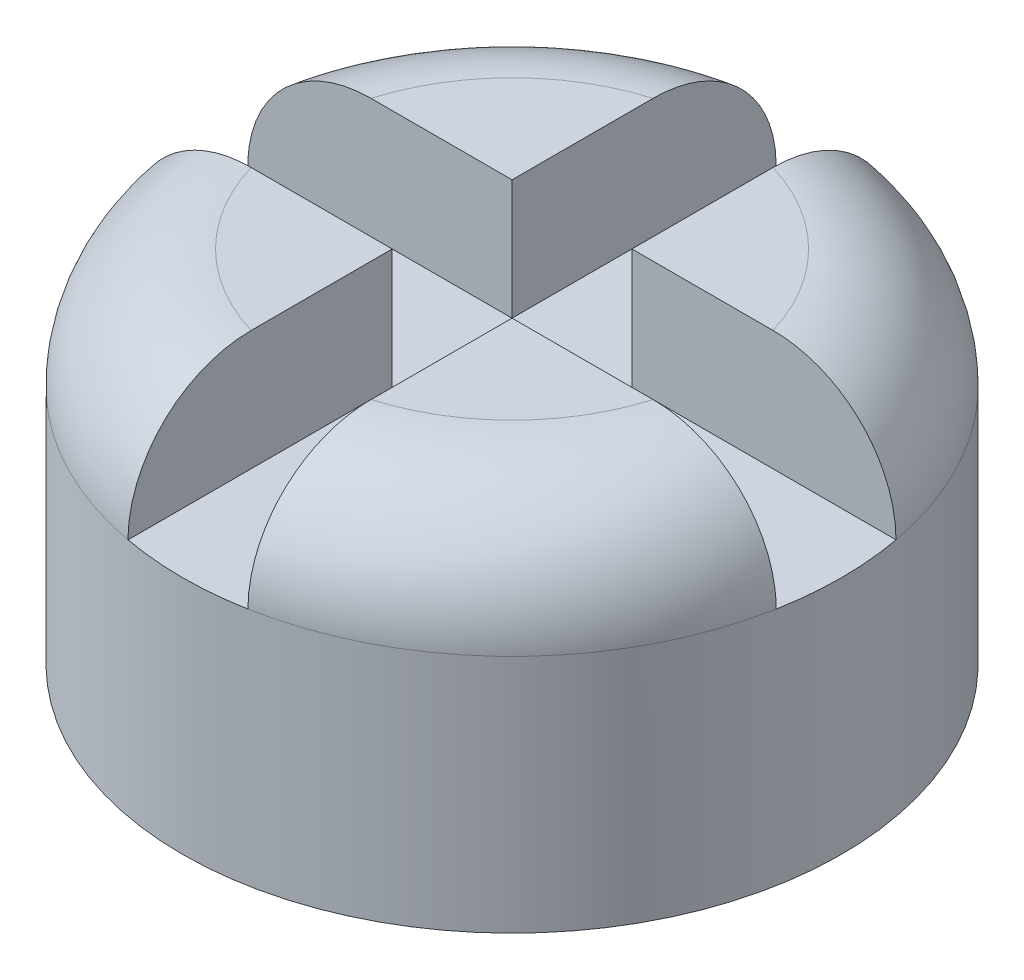
ISO-10303-21;
HEADER;
FILE_DESCRIPTION(('STEP AP214'),'2;1');
FILE_NAME('part.step','',(''),(''),'','','');
FILE_SCHEMA(('AUTOMOTIVE_DESIGN { 1 0 10303 214 1 1 1 1 }'));
ENDSEC;
DATA;
#1=APPLICATION_CONTEXT('core data for automotive mechanical design processes');
#2=APPLICATION_PROTOCOL_DEFINITION('international standard','automotive_design',2000,#1);
#3=PRODUCT_CONTEXT('',#1,'mechanical');
#4=PRODUCT('Part','Part','',(#3));
#5=PRODUCT_RELATED_PRODUCT_CATEGORY('part','',(#4));
#6=PRODUCT_DEFINITION_FORMATION('','',#4);
#7=PRODUCT_DEFINITION_CONTEXT('part definition',#1,'design');
#8=PRODUCT_DEFINITION('design','',#6,#7);
#9=PRODUCT_DEFINITION_SHAPE('','',#8);
#10=(LENGTH_UNIT() NAMED_UNIT(*) SI_UNIT(.MILLI.,.METRE.));
#11=(NAMED_UNIT(*) PLANE_ANGLE_UNIT() SI_UNIT($,.RADIAN.));
#12=(NAMED_UNIT(*) SI_UNIT($,.STERADIAN.) SOLID_ANGLE_UNIT());
#13=UNCERTAINTY_MEASURE_WITH_UNIT(LENGTH_MEASURE(1.E-05),#10,'distance_accuracy_value','');
#14=(GEOMETRIC_REPRESENTATION_CONTEXT(3) GLOBAL_UNCERTAINTY_ASSIGNED_CONTEXT((#13)) GLOBAL_UNIT_ASSIGNED_CONTEXT((#10,
#11,#12)) REPRESENTATION_CONTEXT('',''));
#15=CARTESIAN_POINT('',(0.,0.,0.));
#16=DIRECTION('',(0.,0.,1.));
#17=DIRECTION('',(1.,0.,0.));
#18=AXIS2_PLACEMENT_3D('',#15,#16,#17);
#19=CARTESIAN_POINT('',(7.3,17.,-20.));
#20=DIRECTION('',(0.,-1.,0.));
#21=DIRECTION('',(0.,0.,-1.));
#22=AXIS2_PLACEMENT_3D('',#19,#20,#21);
#23=CYLINDRICAL_SURFACE('',#22,2.75);
#24=CARTESIAN_POINT('',(7.3,14.,-20.));
#25=DIRECTION('',(0.,1.,0.));
#26=DIRECTION('',(0.,0.,1.));
#27=AXIS2_PLACEMENT_3D('',#24,#25,#26);
#28=CIRCLE('',#27,2.75);
#29=CARTESIAN_POINT('',(7.3,14.,-17.25));
#30=VERTEX_POINT('',#29);
#31=EDGE_CURVE('E11',#30,#30,#28,.T.);
#32=ORIENTED_EDGE('',*,*,#31,.T.);
#33=EDGE_LOOP('',(#32));
#34=FACE_BOUND('',#33,.T.);
#35=CARTESIAN_POINT('',(7.3,16.,-20.));
#36=DIRECTION('',(0.,1.,0.));
#37=DIRECTION('',(0.,0.,1.));
#38=AXIS2_PLACEMENT_3D('',#35,#36,#37);
#39=CIRCLE('',#38,2.75);
#40=CARTESIAN_POINT('',(6.8,16.,-17.295836543402));
#41=VERTEX_POINT('',#40);
#42=CARTESIAN_POINT('',(7.8,16.,-17.295836543402));
#43=VERTEX_POINT('',#42);
#44=EDGE_CURVE('E196',#41,#43,#39,.T.);
#45=ORIENTED_EDGE('',*,*,#44,.F.);
#46=CARTESIAN_POINT('',(7.3,16.,-20.));
#47=DIRECTION('',(0.,-1.,0.));
#48=DIRECTION('',(0.,0.,1.));
#49=AXIS2_PLACEMENT_3D('',#46,#47,#48);
#50=CIRCLE('',#49,2.75);
#51=CARTESIAN_POINT('',(4.59583654340201,16.,-19.5));
#52=VERTEX_POINT('',#51);
#53=EDGE_CURVE('E120',#41,#52,#50,.T.);
#54=ORIENTED_EDGE('',*,*,#53,.T.);
#55=CARTESIAN_POINT('',(7.3,16.,-20.));
#56=DIRECTION('',(0.,1.,0.));
#57=DIRECTION('',(0.,0.,1.));
#58=AXIS2_PLACEMENT_3D('',#55,#56,#57);
#59=CIRCLE('',#58,2.75);
#60=CARTESIAN_POINT('',(4.59583654340201,16.,-20.5));
#61=VERTEX_POINT('',#60);
#62=EDGE_CURVE('E114',#61,#52,#59,.T.);
#63=ORIENTED_EDGE('',*,*,#62,.F.);
#64=CARTESIAN_POINT('',(7.3,16.,-20.));
#65=DIRECTION('',(0.,-1.,0.));
#66=DIRECTION('',(0.,0.,1.));
#67=AXIS2_PLACEMENT_3D('',#64,#65,#66);
#68=CIRCLE('',#67,2.75);
#69=CARTESIAN_POINT('',(6.8,16.,-22.704163456598));
#70=VERTEX_POINT('',#69);
#71=EDGE_CURVE('E117',#61,#70,#68,.T.);
#72=ORIENTED_EDGE('',*,*,#71,.T.);
#73=CARTESIAN_POINT('',(7.3,16.,-20.));
#74=DIRECTION('',(0.,1.,0.));
#75=DIRECTION('',(0.,0.,1.));
#76=AXIS2_PLACEMENT_3D('',#73,#74,#75);
#77=CIRCLE('',#76,2.75);
#78=CARTESIAN_POINT('',(7.8,16.,-22.704163456598));
#79=VERTEX_POINT('',#78);
#80=EDGE_CURVE('E41',#79,#70,#77,.T.);
#81=ORIENTED_EDGE('',*,*,#80,.F.);
#82=CARTESIAN_POINT('',(7.3,16.,-20.));
#83=DIRECTION('',(0.,-1.,0.));
#84=DIRECTION('',(0.,0.,1.));
#85=AXIS2_PLACEMENT_3D('',#82,#83,#84);
#86=CIRCLE('',#85,2.75);
#87=CARTESIAN_POINT('',(10.004163456598,16.,-20.5));
#88=VERTEX_POINT('',#87);
#89=EDGE_CURVE('E32',#79,#88,#86,.T.);
#90=ORIENTED_EDGE('',*,*,#89,.T.);
#91=CARTESIAN_POINT('',(7.3,16.,-20.));
#92=DIRECTION('',(0.,1.,0.));
#93=DIRECTION('',(0.,0.,1.));
#94=AXIS2_PLACEMENT_3D('',#91,#92,#93);
#95=CIRCLE('',#94,2.75);
#96=CARTESIAN_POINT('',(10.004163456598,16.,-19.5));
#97=VERTEX_POINT('',#96);
#98=EDGE_CURVE('E165',#97,#88,#95,.T.);
#99=ORIENTED_EDGE('',*,*,#98,.F.);
#100=CARTESIAN_POINT('',(7.3,16.,-20.));
#101=DIRECTION('',(0.,-1.,0.));
#102=DIRECTION('',(0.,0.,1.));
#103=AXIS2_PLACEMENT_3D('',#100,#101,#102);
#104=CIRCLE('',#103,2.75);
#105=EDGE_CURVE('E171',#97,#43,#104,.T.);
#106=ORIENTED_EDGE('',*,*,#105,.T.);
#107=EDGE_LOOP('',(#45,#54,#63,#72,#81,#90,#99,#106));
#108=FACE_BOUND('',#107,.T.);
#109=ADVANCED_FACE('F16',(#34,#108),#23,.T.);
#110=CARTESIAN_POINT('',(7.3,17.,-20.));
#111=DIRECTION('',(0.,1.,0.));
#112=DIRECTION('',(0.,0.,1.));
#113=AXIS2_PLACEMENT_3D('',#110,#111,#112);
#114=PLANE('',#113);
#115=DIRECTION('',(-1.,0.,0.));
#116=VECTOR('',#115,1.);
#117=CARTESIAN_POINT('',(7.3,17.,-20.5));
#118=LINE('',#117,#116);
#119=CARTESIAN_POINT('',(8.97705098312484,17.,-20.5));
#120=VERTEX_POINT('',#119);
#121=CARTESIAN_POINT('',(7.8,17.,-20.5));
#122=VERTEX_POINT('',#121);
#123=EDGE_CURVE('E181',#120,#122,#118,.T.);
#124=ORIENTED_EDGE('',*,*,#123,.F.);
#125=CARTESIAN_POINT('',(7.3,17.,-20.));
#126=DIRECTION('',(0.,1.,0.));
#127=DIRECTION('',(0.,0.,1.));
#128=AXIS2_PLACEMENT_3D('',#125,#126,#127);
#129=CIRCLE('',#128,1.75);
#130=CARTESIAN_POINT('',(7.8,17.,-21.6770509831248));
#131=VERTEX_POINT('',#130);
#132=EDGE_CURVE('E168',#120,#131,#129,.T.);
#133=ORIENTED_EDGE('',*,*,#132,.T.);
#134=DIRECTION('',(0.,0.,-1.));
#135=VECTOR('',#134,1.);
#136=CARTESIAN_POINT('',(7.8,17.,-23.5413517388997));
#137=LINE('',#136,#135);
#138=EDGE_CURVE('E163',#122,#131,#137,.T.);
#139=ORIENTED_EDGE('',*,*,#138,.F.);
#140=EDGE_LOOP('',(#124,#133,#139));
#141=FACE_BOUND('',#140,.T.);
#142=ADVANCED_FACE('F314',(#141),#114,.T.);
#143=CARTESIAN_POINT('',(7.3,17.,-20.));
#144=DIRECTION('',(0.,1.,0.));
#145=DIRECTION('',(0.,0.,1.));
#146=AXIS2_PLACEMENT_3D('',#143,#144,#145);
#147=PLANE('',#146);
#148=DIRECTION('',(0.,0.,-1.));
#149=VECTOR('',#148,1.);
#150=CARTESIAN_POINT('',(7.8,17.,-20.));
#151=LINE('',#150,#149);
#152=CARTESIAN_POINT('',(7.8,17.,-18.3229490168751));
#153=VERTEX_POINT('',#152);
#154=CARTESIAN_POINT('',(7.8,17.,-19.5));
#155=VERTEX_POINT('',#154);
#156=EDGE_CURVE('E200',#153,#155,#151,.T.);
#157=ORIENTED_EDGE('',*,*,#156,.F.);
#158=CARTESIAN_POINT('',(7.3,17.,-20.));
#159=DIRECTION('',(0.,1.,0.));
#160=DIRECTION('',(0.,0.,1.));
#161=AXIS2_PLACEMENT_3D('',#158,#159,#160);
#162=CIRCLE('',#161,1.75);
#163=CARTESIAN_POINT('',(8.97705098312484,17.,-19.5));
#164=VERTEX_POINT('',#163);
#165=EDGE_CURVE('E172',#153,#164,#162,.T.);
#166=ORIENTED_EDGE('',*,*,#165,.T.);
#167=DIRECTION('',(1.,0.,0.));
#168=VECTOR('',#167,1.);
#169=CARTESIAN_POINT('',(7.8,17.,-19.5));
#170=LINE('',#169,#168);
#171=EDGE_CURVE('E184',#155,#164,#170,.T.);
#172=ORIENTED_EDGE('',*,*,#171,.F.);
#173=EDGE_LOOP('',(#157,#166,#172));
#174=FACE_BOUND('',#173,.T.);
#175=ADVANCED_FACE('F318',(#174),#147,.T.);
#176=CARTESIAN_POINT('',(7.3,17.,-20.));
#177=DIRECTION('',(0.,1.,0.));
#178=DIRECTION('',(0.,0.,1.));
#179=AXIS2_PLACEMENT_3D('',#176,#177,#178);
#180=PLANE('',#179);
#181=DIRECTION('',(1.,0.,0.));
#182=VECTOR('',#181,1.);
#183=CARTESIAN_POINT('',(7.3,17.,-19.5));
#184=LINE('',#183,#182);
#185=CARTESIAN_POINT('',(5.62294901687516,17.,-19.5));
#186=VERTEX_POINT('',#185);
#187=CARTESIAN_POINT('',(6.8,17.,-19.5));
#188=VERTEX_POINT('',#187);
#189=EDGE_CURVE('E141',#186,#188,#184,.T.);
#190=ORIENTED_EDGE('',*,*,#189,.F.);
#191=CARTESIAN_POINT('',(7.3,17.,-20.));
#192=DIRECTION('',(0.,1.,0.));
#193=DIRECTION('',(0.,0.,1.));
#194=AXIS2_PLACEMENT_3D('',#191,#192,#193);
#195=CIRCLE('',#194,1.75);
#196=CARTESIAN_POINT('',(6.8,17.,-18.3229490168751));
#197=VERTEX_POINT('',#196);
#198=EDGE_CURVE('E188',#186,#197,#195,.T.);
#199=ORIENTED_EDGE('',*,*,#198,.T.);
#200=DIRECTION('',(0.,0.,1.));
#201=VECTOR('',#200,1.);
#202=CARTESIAN_POINT('',(6.8,17.,-19.5));
#203=LINE('',#202,#201);
#204=EDGE_CURVE('E203',#188,#197,#203,.T.);
#205=ORIENTED_EDGE('',*,*,#204,.F.);
#206=EDGE_LOOP('',(#190,#199,#205));
#207=FACE_BOUND('',#206,.T.);
#208=ADVANCED_FACE('F297',(#207),#180,.T.);
#209=CARTESIAN_POINT('',(7.3,17.,-20.));
#210=DIRECTION('',(0.,1.,0.));
#211=DIRECTION('',(0.,0.,1.));
#212=AXIS2_PLACEMENT_3D('',#209,#210,#211);
#213=PLANE('',#212);
#214=DIRECTION('',(0.,0.,1.));
#215=VECTOR('',#214,1.);
#216=CARTESIAN_POINT('',(6.8,17.,-20.));
#217=LINE('',#216,#215);
#218=CARTESIAN_POINT('',(6.8,17.,-21.6770509831248));
#219=VERTEX_POINT('',#218);
#220=CARTESIAN_POINT('',(6.8,17.,-20.5));
#221=VERTEX_POINT('',#220);
#222=EDGE_CURVE('E161',#219,#221,#217,.T.);
#223=ORIENTED_EDGE('',*,*,#222,.F.);
#224=CARTESIAN_POINT('',(7.3,17.,-20.));
#225=DIRECTION('',(0.,1.,0.));
#226=DIRECTION('',(0.,0.,1.));
#227=AXIS2_PLACEMENT_3D('',#224,#225,#226);
#228=CIRCLE('',#227,1.75);
#229=CARTESIAN_POINT('',(5.62294901687516,17.,-20.5));
#230=VERTEX_POINT('',#229);
#231=EDGE_CURVE('E137',#219,#230,#228,.T.);
#232=ORIENTED_EDGE('',*,*,#231,.T.);
#233=DIRECTION('',(-1.,0.,0.));
#234=VECTOR('',#233,1.);
#235=CARTESIAN_POINT('',(4.48678535495731,17.,-20.5));
#236=LINE('',#235,#234);
#237=EDGE_CURVE('E86',#221,#230,#236,.T.);
#238=ORIENTED_EDGE('',*,*,#237,.F.);
#239=EDGE_LOOP('',(#223,#232,#238));
#240=FACE_BOUND('',#239,.T.);
#241=ADVANCED_FACE('F332',(#240),#213,.T.);
#242=CARTESIAN_POINT('',(7.3,14.,-20.));
#243=DIRECTION('',(0.,1.,0.));
#244=DIRECTION('',(0.,0.,1.));
#245=AXIS2_PLACEMENT_3D('',#242,#243,#244);
#246=PLANE('',#245);
#247=ORIENTED_EDGE('',*,*,#31,.F.);
#248=EDGE_LOOP('',(#247));
#249=FACE_BOUND('',#248,.T.);
#250=ADVANCED_FACE('F334',(#249),#246,.F.);
#251=CARTESIAN_POINT('',(0.,16.,-10.));
#252=DIRECTION('',(0.,1.,0.));
#253=DIRECTION('',(0.,0.,1.));
#254=AXIS2_PLACEMENT_3D('',#251,#252,#253);
#255=PLANE('',#254);
#256=ORIENTED_EDGE('',*,*,#98,.T.);
#257=DIRECTION('',(-1.,0.,0.));
#258=VECTOR('',#257,1.);
#259=CARTESIAN_POINT('',(7.8,16.,-20.5));
#260=LINE('',#259,#258);
#261=CARTESIAN_POINT('',(7.8,16.,-20.5));
#262=VERTEX_POINT('',#261);
#263=EDGE_CURVE('E176',#88,#262,#260,.T.);
#264=ORIENTED_EDGE('',*,*,#263,.T.);
#265=DIRECTION('',(0.,0.,-1.));
#266=VECTOR('',#265,1.);
#267=CARTESIAN_POINT('',(7.8,16.,-23.5413517388997));
#268=LINE('',#267,#266);
#269=EDGE_CURVE('E174',#262,#79,#268,.T.);
#270=ORIENTED_EDGE('',*,*,#269,.T.);
#271=ORIENTED_EDGE('',*,*,#80,.T.);
#272=DIRECTION('',(0.,0.,1.));
#273=VECTOR('',#272,1.);
#274=CARTESIAN_POINT('',(6.8,16.,-23.5413517388997));
#275=LINE('',#274,#273);
#276=CARTESIAN_POINT('',(6.8,16.,-20.5));
#277=VERTEX_POINT('',#276);
#278=EDGE_CURVE('E128',#70,#277,#275,.T.);
#279=ORIENTED_EDGE('',*,*,#278,.T.);
#280=DIRECTION('',(-1.,0.,0.));
#281=VECTOR('',#280,1.);
#282=CARTESIAN_POINT('',(4.48678535495731,16.,-20.5));
#283=LINE('',#282,#281);
#284=EDGE_CURVE('E123',#277,#61,#283,.T.);
#285=ORIENTED_EDGE('',*,*,#284,.T.);
#286=ORIENTED_EDGE('',*,*,#62,.T.);
#287=DIRECTION('',(1.,0.,0.));
#288=VECTOR('',#287,1.);
#289=CARTESIAN_POINT('',(4.48678535495731,16.,-19.5));
#290=LINE('',#289,#288);
#291=CARTESIAN_POINT('',(6.8,16.,-19.5));
#292=VERTEX_POINT('',#291);
#293=EDGE_CURVE('E124',#52,#292,#290,.T.);
#294=ORIENTED_EDGE('',*,*,#293,.T.);
#295=DIRECTION('',(0.,0.,1.));
#296=VECTOR('',#295,1.);
#297=CARTESIAN_POINT('',(6.8,16.,-19.5));
#298=LINE('',#297,#296);
#299=EDGE_CURVE('E199',#292,#41,#298,.T.);
#300=ORIENTED_EDGE('',*,*,#299,.T.);
#301=ORIENTED_EDGE('',*,*,#44,.T.);
#302=DIRECTION('',(0.,0.,-1.));
#303=VECTOR('',#302,1.);
#304=CARTESIAN_POINT('',(7.8,16.,-19.5));
#305=LINE('',#304,#303);
#306=CARTESIAN_POINT('',(7.8,16.,-19.5));
#307=VERTEX_POINT('',#306);
#308=EDGE_CURVE('E191',#43,#307,#305,.T.);
#309=ORIENTED_EDGE('',*,*,#308,.T.);
#310=DIRECTION('',(1.,0.,0.));
#311=VECTOR('',#310,1.);
#312=CARTESIAN_POINT('',(7.8,16.,-19.5));
#313=LINE('',#312,#311);
#314=EDGE_CURVE('E189',#307,#97,#313,.T.);
#315=ORIENTED_EDGE('',*,*,#314,.T.);
#316=EDGE_LOOP('',(#256,#264,#270,#271,#279,#285,#286,#294,#300,#301,#309,#315));
#317=FACE_BOUND('',#316,.T.);
#318=ADVANCED_FACE('F127',(#317),#255,.T.);
#319=CARTESIAN_POINT('',(6.8,16.,-23.5413517388997));
#320=DIRECTION('',(-1.,0.,0.));
#321=DIRECTION('',(0.,0.,1.));
#322=AXIS2_PLACEMENT_3D('',#319,#320,#321);
#323=PLANE('',#322);
#324=ORIENTED_EDGE('',*,*,#278,.F.);
#325=CARTESIAN_POINT('',(6.8,16.,-22.704163456598));
#326=CARTESIAN_POINT('',(6.8,16.0277545929428,-22.704163426106));
#327=CARTESIAN_POINT('',(6.8,16.0554958108671,-22.7029876418777));
#328=CARTESIAN_POINT('',(6.8,16.1107779430468,-22.6982980351561));
#329=CARTESIAN_POINT('',(6.8,16.1383188711861,-22.6947843763141));
#330=CARTESIAN_POINT('',(6.8,16.2202768314456,-22.6807753322756));
#331=CARTESIAN_POINT('',(6.8,16.2741419478486,-22.6668117530923));
#332=CARTESIAN_POINT('',(6.8,16.3787567692978,-22.6300485415268));
#333=CARTESIAN_POINT('',(6.8,16.4295053126033,-22.6072456370609));
#334=CARTESIAN_POINT('',(6.8,16.5264834779102,-22.553487433775));
#335=CARTESIAN_POINT('',(6.8,16.5727134034118,-22.5225326830035));
#336=CARTESIAN_POINT('',(6.8,16.6596264881469,-22.4532008204662));
#337=CARTESIAN_POINT('',(6.8,16.7002785901554,-22.4147848160517));
#338=CARTESIAN_POINT('',(6.8,16.7746764006121,-22.3317625276041));
#339=CARTESIAN_POINT('',(6.8,16.8084213395481,-22.2871555547765));
#340=CARTESIAN_POINT('',(6.8,16.8686339857272,-22.1922992111858));
#341=CARTESIAN_POINT('',(6.8,16.894979843849,-22.1419726173571));
#342=CARTESIAN_POINT('',(6.8,16.9390875106307,-22.0376845166449));
#343=CARTESIAN_POINT('',(6.8,16.956849317861,-21.983723009156));
#344=CARTESIAN_POINT('',(6.8,16.9801261183746,-21.8875186866817));
#345=CARTESIAN_POINT('',(6.8,16.987596323596,-21.8457353708182));
#346=CARTESIAN_POINT('',(6.8,16.9975341738986,-21.761652693907));
#347=CARTESIAN_POINT('',(6.8,17.0000107665528,-21.7193543927228));
#348=CARTESIAN_POINT('',(6.8,17.,-21.6770509831248));
#349=B_SPLINE_CURVE_WITH_KNOTS('',3,(#325,#326,#327,#328,#329,#330,#331,#332,#333,#334,#335,
#336,#337,#338,#339,#340,#341,#342,#343,#344,#345,#346,#347,#348),.UNSPECIFIED.,.F.,.F.,(4,2,2,
2,2,2,2,2,2,2,2,4),(0.,0.0832123577889977,0.16641889132337,0.332497568062903,0.498637781518847,
0.664766828220994,0.831786282363319,0.998824333670173,1.16847042710805,1.33811654879978,
1.46516756856481,1.59199073482873),.UNSPECIFIED.);
#350=EDGE_CURVE('E136',#70,#219,#349,.T.);
#351=ORIENTED_EDGE('',*,*,#350,.T.);
#352=ORIENTED_EDGE('',*,*,#222,.T.);
#353=DIRECTION('',(0.,1.,0.));
#354=VECTOR('',#353,1.);
#355=CARTESIAN_POINT('',(6.8,16.,-20.5));
#356=LINE('',#355,#354);
#357=EDGE_CURVE('E140',#277,#221,#356,.T.);
#358=ORIENTED_EDGE('',*,*,#357,.F.);
#359=EDGE_LOOP('',(#324,#351,#352,#358));
#360=FACE_BOUND('',#359,.T.);
#361=ADVANCED_FACE('F225',(#360),#323,.F.);
#362=CARTESIAN_POINT('',(7.8,16.,-23.5413517388997));
#363=DIRECTION('',(1.,0.,0.));
#364=DIRECTION('',(0.,0.,-1.));
#365=AXIS2_PLACEMENT_3D('',#362,#363,#364);
#366=PLANE('',#365);
#367=ORIENTED_EDGE('',*,*,#138,.T.);
#368=CARTESIAN_POINT('',(7.8,17.,-21.6770509831248));
#369=CARTESIAN_POINT('',(7.8,16.9999999231679,-21.706781573073));
#370=CARTESIAN_POINT('',(7.8,16.9987814522052,-21.7365001186023));
#371=CARTESIAN_POINT('',(7.8,16.9938893731335,-21.7957389482215));
#372=CARTESIAN_POINT('',(7.8,16.9902153582565,-21.8252591986448));
#373=CARTESIAN_POINT('',(7.8,16.9754859290339,-21.9132292470956));
#374=CARTESIAN_POINT('',(7.8,16.9607231507949,-21.9711058831804));
#375=CARTESIAN_POINT('',(7.8,16.921511909225,-22.0835587480474));
#376=CARTESIAN_POINT('',(7.8,16.8970486199233,-22.1381297767772));
#377=CARTESIAN_POINT('',(7.8,16.8390261603774,-22.2421702154784));
#378=CARTESIAN_POINT('',(7.8,16.8054737329733,-22.2916433699357));
#379=CARTESIAN_POINT('',(7.8,16.7313802758615,-22.3824572438857));
#380=CARTESIAN_POINT('',(7.8,16.691093253623,-22.4240053614142));
#381=CARTESIAN_POINT('',(7.8,16.6039509165057,-22.4995618594438));
#382=CARTESIAN_POINT('',(7.8,16.557094150378,-22.5335685697601));
#383=CARTESIAN_POINT('',(7.8,16.4593591389221,-22.5922440377588));
#384=CARTESIAN_POINT('',(7.8,16.408600613629,-22.6171126336152));
#385=CARTESIAN_POINT('',(7.8,16.3036091762787,-22.657828226172));
#386=CARTESIAN_POINT('',(7.8,16.2493794624037,-22.6736833979837));
#387=CARTESIAN_POINT('',(7.8,16.1622609246366,-22.6912351737667));
#388=CARTESIAN_POINT('',(7.8,16.1299746633571,-22.6960815105542));
#389=CARTESIAN_POINT('',(7.8,16.0651306213153,-22.70254415373));
#390=CARTESIAN_POINT('',(7.8,16.0325733337646,-22.7041654098797));
#391=CARTESIAN_POINT('',(7.8,16.,-22.704163456598));
#392=B_SPLINE_CURVE_WITH_KNOTS('',3,(#368,#369,#370,#371,#372,#373,#374,#375,#376,#377,#378,
#379,#380,#381,#382,#383,#384,#385,#386,#387,#388,#389,#390,#391),.UNSPECIFIED.,.F.,.F.,(4,2,2,
2,2,2,2,2,2,2,2,4),(0.,0.0891414453592842,0.178297660919744,0.356558125159143,0.535092093997722,
0.71349397717728,0.88626495161075,1.05907415126094,1.22784071324702,1.39645395994177,
1.4942523251174,1.59190047599825),.UNSPECIFIED.);
#393=EDGE_CURVE('E148',#131,#79,#392,.T.);
#394=ORIENTED_EDGE('',*,*,#393,.T.);
#395=ORIENTED_EDGE('',*,*,#269,.F.);
#396=DIRECTION('',(0.,1.,0.));
#397=VECTOR('',#396,1.);
#398=CARTESIAN_POINT('',(7.8,16.,-20.5));
#399=LINE('',#398,#397);
#400=EDGE_CURVE('E145',#262,#122,#399,.T.);
#401=ORIENTED_EDGE('',*,*,#400,.T.);
#402=EDGE_LOOP('',(#367,#394,#395,#401));
#403=FACE_BOUND('',#402,.T.);
#404=ADVANCED_FACE('F229',(#403),#366,.F.);
#405=CARTESIAN_POINT('',(7.8,16.,-20.5));
#406=DIRECTION('',(0.,0.,-1.));
#407=DIRECTION('',(-1.,0.,0.));
#408=AXIS2_PLACEMENT_3D('',#405,#406,#407);
#409=PLANE('',#408);
#410=ORIENTED_EDGE('',*,*,#263,.F.);
#411=CARTESIAN_POINT('',(10.004163456598,16.,-20.5));
#412=CARTESIAN_POINT('',(10.004163426106,16.0277545929428,-20.5));
#413=CARTESIAN_POINT('',(10.0029876418777,16.0554958108671,-20.5));
#414=CARTESIAN_POINT('',(9.99829803515608,16.1107779430468,-20.5));
#415=CARTESIAN_POINT('',(9.99478437631412,16.1383188711861,-20.5));
#416=CARTESIAN_POINT('',(9.98077533227562,16.2202768314456,-20.5));
#417=CARTESIAN_POINT('',(9.96681175309234,16.2741419478486,-20.5));
#418=CARTESIAN_POINT('',(9.9300485415268,16.3787567692978,-20.5));
#419=CARTESIAN_POINT('',(9.90724563706092,16.4295053126033,-20.5));
#420=CARTESIAN_POINT('',(9.85348743377505,16.5264834779102,-20.5));
#421=CARTESIAN_POINT('',(9.82253268300357,16.5727134034118,-20.5));
#422=CARTESIAN_POINT('',(9.75320082046626,16.6596264881469,-20.5));
#423=CARTESIAN_POINT('',(9.71478481605176,16.7002785901554,-20.5));
#424=CARTESIAN_POINT('',(9.63176252760416,16.7746764006121,-20.5));
#425=CARTESIAN_POINT('',(9.58715555477646,16.8084213395481,-20.5));
#426=CARTESIAN_POINT('',(9.49229921118582,16.8686339857272,-20.5));
#427=CARTESIAN_POINT('',(9.44197261735714,16.894979843849,-20.5));
#428=CARTESIAN_POINT('',(9.3376845166449,16.9390875106307,-20.5));
#429=CARTESIAN_POINT('',(9.28372300915597,16.956849317861,-20.5));
#430=CARTESIAN_POINT('',(9.18751868668169,16.9801261183746,-20.5));
#431=CARTESIAN_POINT('',(9.1457353708182,16.987596323596,-20.5));
#432=CARTESIAN_POINT('',(9.06165269390701,16.9975341738986,-20.5));
#433=CARTESIAN_POINT('',(9.0193543927228,17.0000107665528,-20.5));
#434=CARTESIAN_POINT('',(8.97705098312484,17.,-20.5));
#435=B_SPLINE_CURVE_WITH_KNOTS('',3,(#411,#412,#413,#414,#415,#416,#417,#418,#419,#420,#421,
#422,#423,#424,#425,#426,#427,#428,#429,#430,#431,#432,#433,#434),.UNSPECIFIED.,.F.,.F.,(4,2,2,
2,2,2,2,2,2,2,2,4),(0.,0.0832123577889941,0.16641889132337,0.332497568062903,0.498637781518847,
0.664766828220994,0.831786282363318,0.998824333670174,1.16847042710805,1.33811654879978,
1.46516756856481,1.59199073482873),.UNSPECIFIED.);
#436=EDGE_CURVE('E149',#88,#120,#435,.T.);
#437=ORIENTED_EDGE('',*,*,#436,.T.);
#438=ORIENTED_EDGE('',*,*,#123,.T.);
#439=ORIENTED_EDGE('',*,*,#400,.F.);
#440=EDGE_LOOP('',(#410,#437,#438,#439));
#441=FACE_BOUND('',#440,.T.);
#442=ADVANCED_FACE('F235',(#441),#409,.F.);
#443=CARTESIAN_POINT('',(7.8,16.,-19.5));
#444=DIRECTION('',(0.,0.,1.));
#445=DIRECTION('',(1.,0.,0.));
#446=AXIS2_PLACEMENT_3D('',#443,#444,#445);
#447=PLANE('',#446);
#448=ORIENTED_EDGE('',*,*,#171,.T.);
#449=CARTESIAN_POINT('',(8.97705098312484,17.,-19.5));
#450=CARTESIAN_POINT('',(9.00678157307304,16.9999999231679,-19.5));
#451=CARTESIAN_POINT('',(9.03650011860231,16.9987814522052,-19.5));
#452=CARTESIAN_POINT('',(9.09573894822153,16.9938893731335,-19.5));
#453=CARTESIAN_POINT('',(9.12525919864486,16.9902153582565,-19.5));
#454=CARTESIAN_POINT('',(9.21322924709563,16.9754859290339,-19.5));
#455=CARTESIAN_POINT('',(9.27110588318037,16.9607231507949,-19.5));
#456=CARTESIAN_POINT('',(9.38355874804746,16.921511909225,-19.5));
#457=CARTESIAN_POINT('',(9.43812977677725,16.8970486199233,-19.5));
#458=CARTESIAN_POINT('',(9.54217021547847,16.8390261603774,-19.5));
#459=CARTESIAN_POINT('',(9.59164336993568,16.8054737329733,-19.5));
#460=CARTESIAN_POINT('',(9.68245724388567,16.7313802758615,-19.5));
#461=CARTESIAN_POINT('',(9.72400536141422,16.691093253623,-19.5));
#462=CARTESIAN_POINT('',(9.79956185944386,16.6039509165057,-19.5));
#463=CARTESIAN_POINT('',(9.83356856976009,16.557094150378,-19.5));
#464=CARTESIAN_POINT('',(9.89224403775878,16.4593591389221,-19.5));
#465=CARTESIAN_POINT('',(9.91711263361524,16.408600613629,-19.5));
#466=CARTESIAN_POINT('',(9.95782822617201,16.3036091762787,-19.5));
#467=CARTESIAN_POINT('',(9.97368339798368,16.2493794624037,-19.5));
#468=CARTESIAN_POINT('',(9.99123517376674,16.1622609246366,-19.5));
#469=CARTESIAN_POINT('',(9.99608151055422,16.1299746633571,-19.5));
#470=CARTESIAN_POINT('',(10.00254415373,16.0651306213153,-19.5));
#471=CARTESIAN_POINT('',(10.0041654098798,16.0325733337646,-19.5));
#472=CARTESIAN_POINT('',(10.004163456598,16.,-19.5));
#473=B_SPLINE_CURVE_WITH_KNOTS('',3,(#449,#450,#451,#452,#453,#454,#455,#456,#457,#458,#459,
#460,#461,#462,#463,#464,#465,#466,#467,#468,#469,#470,#471,#472),.UNSPECIFIED.,.F.,.F.,(4,2,2,
2,2,2,2,2,2,2,2,4),(0.,0.0891414453592911,0.178297660919751,0.356558125159145,0.535092093997732,
0.713493977177285,0.886264951610751,1.05907415126093,1.22784071324703,1.39645395994177,
1.4942523251174,1.59190047599825),.UNSPECIFIED.);
#474=EDGE_CURVE('E153',#164,#97,#473,.T.);
#475=ORIENTED_EDGE('',*,*,#474,.T.);
#476=ORIENTED_EDGE('',*,*,#314,.F.);
#477=DIRECTION('',(0.,1.,0.));
#478=VECTOR('',#477,1.);
#479=CARTESIAN_POINT('',(7.8,16.,-19.5));
#480=LINE('',#479,#478);
#481=EDGE_CURVE('E150',#307,#155,#480,.T.);
#482=ORIENTED_EDGE('',*,*,#481,.T.);
#483=EDGE_LOOP('',(#448,#475,#476,#482));
#484=FACE_BOUND('',#483,.T.);
#485=ADVANCED_FACE('F240',(#484),#447,.F.);
#486=CARTESIAN_POINT('',(7.8,16.,-19.5));
#487=DIRECTION('',(1.,0.,0.));
#488=DIRECTION('',(0.,0.,-1.));
#489=AXIS2_PLACEMENT_3D('',#486,#487,#488);
#490=PLANE('',#489);
#491=ORIENTED_EDGE('',*,*,#308,.F.);
#492=CARTESIAN_POINT('',(7.8,16.,-17.295836543402));
#493=CARTESIAN_POINT('',(7.8,16.0277545929428,-17.2958365738939));
#494=CARTESIAN_POINT('',(7.8,16.0554958108671,-17.2970123581223));
#495=CARTESIAN_POINT('',(7.8,16.1107779430468,-17.3017019648439));
#496=CARTESIAN_POINT('',(7.8,16.1383188711861,-17.3052156236859));
#497=CARTESIAN_POINT('',(7.8,16.2202768314456,-17.3192246677244));
#498=CARTESIAN_POINT('',(7.8,16.2741419478486,-17.3331882469076));
#499=CARTESIAN_POINT('',(7.8,16.3787567692978,-17.3699514584732));
#500=CARTESIAN_POINT('',(7.8,16.4295053126033,-17.3927543629391));
#501=CARTESIAN_POINT('',(7.8,16.5264834779102,-17.4465125662249));
#502=CARTESIAN_POINT('',(7.8,16.5727134034118,-17.4774673169964));
#503=CARTESIAN_POINT('',(7.8,16.6596264881469,-17.5467991795337));
#504=CARTESIAN_POINT('',(7.8,16.7002785901554,-17.5852151839482));
#505=CARTESIAN_POINT('',(7.8,16.7746764006121,-17.6682374723958));
#506=CARTESIAN_POINT('',(7.8,16.8084213395481,-17.7128444452235));
#507=CARTESIAN_POINT('',(7.8,16.8686339857272,-17.8077007888142));
#508=CARTESIAN_POINT('',(7.8,16.894979843849,-17.8580273826428));
#509=CARTESIAN_POINT('',(7.8,16.9390875106307,-17.9623154833551));
#510=CARTESIAN_POINT('',(7.8,16.956849317861,-18.016276990844));
#511=CARTESIAN_POINT('',(7.8,16.9801261183746,-18.1124813133183));
#512=CARTESIAN_POINT('',(7.8,16.987596323596,-18.1542646291818));
#513=CARTESIAN_POINT('',(7.8,16.9975341738986,-18.238347306093));
#514=CARTESIAN_POINT('',(7.8,17.0000107665528,-18.2806456072772));
#515=CARTESIAN_POINT('',(7.8,17.,-18.3229490168751));
#516=B_SPLINE_CURVE_WITH_KNOTS('',3,(#492,#493,#494,#495,#496,#497,#498,#499,#500,#501,#502,
#503,#504,#505,#506,#507,#508,#509,#510,#511,#512,#513,#514,#515),.UNSPECIFIED.,.F.,.F.,(4,2,2,
2,2,2,2,2,2,2,2,4),(0.,0.0832123577889975,0.16641889132337,0.332497568062903,0.498637781518847,
0.664766828220994,0.83178628236332,0.998824333670174,1.16847042710805,1.33811654879978,
1.46516756856481,1.59199073482873),.UNSPECIFIED.);
#517=EDGE_CURVE('E154',#43,#153,#516,.T.);
#518=ORIENTED_EDGE('',*,*,#517,.T.);
#519=ORIENTED_EDGE('',*,*,#156,.T.);
#520=ORIENTED_EDGE('',*,*,#481,.F.);
#521=EDGE_LOOP('',(#491,#518,#519,#520));
#522=FACE_BOUND('',#521,.T.);
#523=ADVANCED_FACE('F272',(#522),#490,.F.);
#524=CARTESIAN_POINT('',(6.8,16.,-19.5));
#525=DIRECTION('',(-1.,0.,0.));
#526=DIRECTION('',(0.,0.,1.));
#527=AXIS2_PLACEMENT_3D('',#524,#525,#526);
#528=PLANE('',#527);
#529=ORIENTED_EDGE('',*,*,#204,.T.);
#530=CARTESIAN_POINT('',(6.8,17.,-18.3229490168751));
#531=CARTESIAN_POINT('',(6.8,16.9999999231679,-18.2932184269269));
#532=CARTESIAN_POINT('',(6.8,16.9987814522052,-18.2634998813977));
#533=CARTESIAN_POINT('',(6.8,16.9938893731335,-18.2042610517785));
#534=CARTESIAN_POINT('',(6.8,16.9902153582565,-18.1747408013551));
#535=CARTESIAN_POINT('',(6.8,16.9754859290339,-18.0867707529044));
#536=CARTESIAN_POINT('',(6.8,16.9607231507949,-18.0288941168196));
#537=CARTESIAN_POINT('',(6.8,16.921511909225,-17.9164412519525));
#538=CARTESIAN_POINT('',(6.8,16.8970486199233,-17.8618702232227));
#539=CARTESIAN_POINT('',(6.8,16.8390261603774,-17.7578297845215));
#540=CARTESIAN_POINT('',(6.8,16.8054737329733,-17.7083566300643));
#541=CARTESIAN_POINT('',(6.8,16.7313802758615,-17.6175427561143));
#542=CARTESIAN_POINT('',(6.8,16.691093253623,-17.5759946385858));
#543=CARTESIAN_POINT('',(6.8,16.6039509165057,-17.5004381405561));
#544=CARTESIAN_POINT('',(6.8,16.557094150378,-17.4664314302399));
#545=CARTESIAN_POINT('',(6.8,16.4593591389221,-17.4077559622412));
#546=CARTESIAN_POINT('',(6.8,16.408600613629,-17.3828873663848));
#547=CARTESIAN_POINT('',(6.8,16.3036091762787,-17.342171773828));
#548=CARTESIAN_POINT('',(6.8,16.2493794624037,-17.3263166020163));
#549=CARTESIAN_POINT('',(6.8,16.1622609246366,-17.3087648262332));
#550=CARTESIAN_POINT('',(6.8,16.1299746633571,-17.3039184894458));
#551=CARTESIAN_POINT('',(6.8,16.0651306213153,-17.29745584627));
#552=CARTESIAN_POINT('',(6.8,16.0325733337646,-17.2958345901202));
#553=CARTESIAN_POINT('',(6.8,16.,-17.295836543402));
#554=B_SPLINE_CURVE_WITH_KNOTS('',3,(#530,#531,#532,#533,#534,#535,#536,#537,#538,#539,#540,
#541,#542,#543,#544,#545,#546,#547,#548,#549,#550,#551,#552,#553),.UNSPECIFIED.,.F.,.F.,(4,2,2,
2,2,2,2,2,2,2,2,4),(0.,0.0891414453592842,0.178297660919744,0.356558125159143,0.535092093997738,
0.713493977177285,0.886264951610753,1.05907415126094,1.22784071324702,1.39645395994177,
1.4942523251174,1.59190047599825),.UNSPECIFIED.);
#555=EDGE_CURVE('E158',#197,#41,#554,.T.);
#556=ORIENTED_EDGE('',*,*,#555,.T.);
#557=ORIENTED_EDGE('',*,*,#299,.F.);
#558=DIRECTION('',(0.,1.,0.));
#559=VECTOR('',#558,1.);
#560=CARTESIAN_POINT('',(6.8,16.,-19.5));
#561=LINE('',#560,#559);
#562=EDGE_CURVE('E155',#292,#188,#561,.T.);
#563=ORIENTED_EDGE('',*,*,#562,.T.);
#564=EDGE_LOOP('',(#529,#556,#557,#563));
#565=FACE_BOUND('',#564,.T.);
#566=ADVANCED_FACE('F275',(#565),#528,.F.);
#567=CARTESIAN_POINT('',(4.48678535495731,16.,-19.5));
#568=DIRECTION('',(0.,0.,1.));
#569=DIRECTION('',(1.,0.,0.));
#570=AXIS2_PLACEMENT_3D('',#567,#568,#569);
#571=PLANE('',#570);
#572=ORIENTED_EDGE('',*,*,#293,.F.);
#573=CARTESIAN_POINT('',(4.59583654340201,16.,-19.5));
#574=CARTESIAN_POINT('',(4.59583657389396,16.0277545929428,-19.5));
#575=CARTESIAN_POINT('',(4.59701235812231,16.0554958108671,-19.5));
#576=CARTESIAN_POINT('',(4.60170196484392,16.1107779430468,-19.5));
#577=CARTESIAN_POINT('',(4.60521562368589,16.1383188711861,-19.5));
#578=CARTESIAN_POINT('',(4.61922466772437,16.2202768314456,-19.5));
#579=CARTESIAN_POINT('',(4.63318824690765,16.2741419478486,-19.5));
#580=CARTESIAN_POINT('',(4.6699514584732,16.3787567692978,-19.5));
#581=CARTESIAN_POINT('',(4.69275436293908,16.4295053126033,-19.5));
#582=CARTESIAN_POINT('',(4.74651256622494,16.5264834779102,-19.5));
#583=CARTESIAN_POINT('',(4.77746731699643,16.5727134034118,-19.5));
#584=CARTESIAN_POINT('',(4.84679917953374,16.6596264881469,-19.5));
#585=CARTESIAN_POINT('',(4.88521518394824,16.7002785901554,-19.5));
#586=CARTESIAN_POINT('',(4.96823747239584,16.7746764006121,-19.5));
#587=CARTESIAN_POINT('',(5.01284444522353,16.8084213395481,-19.5));
#588=CARTESIAN_POINT('',(5.10770078881418,16.8686339857272,-19.5));
#589=CARTESIAN_POINT('',(5.15802738264286,16.894979843849,-19.5));
#590=CARTESIAN_POINT('',(5.26231548335509,16.9390875106307,-19.5));
#591=CARTESIAN_POINT('',(5.31627699084403,16.956849317861,-19.5));
#592=CARTESIAN_POINT('',(5.41248131331831,16.9801261183746,-19.5));
#593=CARTESIAN_POINT('',(5.4542646291818,16.987596323596,-19.5));
#594=CARTESIAN_POINT('',(5.53834730609299,16.9975341738986,-19.5));
#595=CARTESIAN_POINT('',(5.5806456072772,17.0000107665528,-19.5));
#596=CARTESIAN_POINT('',(5.62294901687516,17.,-19.5));
#597=B_SPLINE_CURVE_WITH_KNOTS('',3,(#573,#574,#575,#576,#577,#578,#579,#580,#581,#582,#583,
#584,#585,#586,#587,#588,#589,#590,#591,#592,#593,#594,#595,#596),.UNSPECIFIED.,.F.,.F.,(4,2,2,
2,2,2,2,2,2,2,2,4),(0.,0.0832123577889976,0.16641889132337,0.332497568062903,0.498637781518839,
0.664766828220994,0.831786282363317,0.998824333670174,1.16847042710804,1.33811654879977,
1.46516756856481,1.59199073482873),.UNSPECIFIED.);
#598=EDGE_CURVE('E159',#52,#186,#597,.T.);
#599=ORIENTED_EDGE('',*,*,#598,.T.);
#600=ORIENTED_EDGE('',*,*,#189,.T.);
#601=ORIENTED_EDGE('',*,*,#562,.F.);
#602=EDGE_LOOP('',(#572,#599,#600,#601));
#603=FACE_BOUND('',#602,.T.);
#604=ADVANCED_FACE('F280',(#603),#571,.F.);
#605=CARTESIAN_POINT('',(4.48678535495731,16.,-20.5));
#606=DIRECTION('',(0.,0.,-1.));
#607=DIRECTION('',(-1.,0.,0.));
#608=AXIS2_PLACEMENT_3D('',#605,#606,#607);
#609=PLANE('',#608);
#610=ORIENTED_EDGE('',*,*,#237,.T.);
#611=CARTESIAN_POINT('',(5.62294901687516,17.,-20.5));
#612=CARTESIAN_POINT('',(5.59321842692696,16.9999999231679,-20.5));
#613=CARTESIAN_POINT('',(5.56349988139769,16.9987814522052,-20.5));
#614=CARTESIAN_POINT('',(5.50426105177847,16.9938893731335,-20.5));
#615=CARTESIAN_POINT('',(5.47474080135514,16.9902153582565,-20.5));
#616=CARTESIAN_POINT('',(5.38677075290437,16.9754859290339,-20.5));
#617=CARTESIAN_POINT('',(5.32889411681962,16.9607231507949,-20.5));
#618=CARTESIAN_POINT('',(5.21644125195254,16.921511909225,-20.5));
#619=CARTESIAN_POINT('',(5.16187022322275,16.8970486199233,-20.5));
#620=CARTESIAN_POINT('',(5.05782978452153,16.8390261603774,-20.5));
#621=CARTESIAN_POINT('',(5.00835663006432,16.8054737329733,-20.5));
#622=CARTESIAN_POINT('',(4.91754275611433,16.7313802758615,-20.5));
#623=CARTESIAN_POINT('',(4.87599463858578,16.691093253623,-20.5));
#624=CARTESIAN_POINT('',(4.80043814055614,16.6039509165057,-20.5));
#625=CARTESIAN_POINT('',(4.76643143023991,16.557094150378,-20.5));
#626=CARTESIAN_POINT('',(4.70775596224122,16.4593591389221,-20.5));
#627=CARTESIAN_POINT('',(4.68288736638476,16.408600613629,-20.5));
#628=CARTESIAN_POINT('',(4.64217177382799,16.3036091762787,-20.5));
#629=CARTESIAN_POINT('',(4.62631660201631,16.2493794624037,-20.5));
#630=CARTESIAN_POINT('',(4.60876482623325,16.1622609246366,-20.5));
#631=CARTESIAN_POINT('',(4.60391848944578,16.1299746633571,-20.5));
#632=CARTESIAN_POINT('',(4.59745584627,16.0651306213153,-20.5));
#633=CARTESIAN_POINT('',(4.59583459012024,16.0325733337646,-20.5));
#634=CARTESIAN_POINT('',(4.59583654340201,16.,-20.5));
#635=B_SPLINE_CURVE_WITH_KNOTS('',3,(#611,#612,#613,#614,#615,#616,#617,#618,#619,#620,#621,
#622,#623,#624,#625,#626,#627,#628,#629,#630,#631,#632,#633,#634),.UNSPECIFIED.,.F.,.F.,(4,2,2,
2,2,2,2,2,2,2,2,4),(0.,0.0891414453592903,0.17829766091975,0.356558125159146,0.535092093997731,
0.713493977177286,0.886264951610755,1.05907415126094,1.22784071324703,1.39645395994177,
1.4942523251174,1.59190047599825),.UNSPECIFIED.);
#636=EDGE_CURVE('E21',#230,#61,#635,.T.);
#637=ORIENTED_EDGE('',*,*,#636,.T.);
#638=ORIENTED_EDGE('',*,*,#284,.F.);
#639=ORIENTED_EDGE('',*,*,#357,.T.);
#640=EDGE_LOOP('',(#610,#637,#638,#639));
#641=FACE_BOUND('',#640,.T.);
#642=ADVANCED_FACE('F139',(#641),#609,.F.);
#643=CARTESIAN_POINT('',(7.3,16.,-20.));
#644=DIRECTION('',(0.,1.,0.));
#645=DIRECTION('',(0.,0.,1.));
#646=AXIS2_PLACEMENT_3D('',#643,#644,#645);
#647=TOROIDAL_SURFACE('',#646,1.75,1.);
#648=ORIENTED_EDGE('',*,*,#350,.F.);
#649=ORIENTED_EDGE('',*,*,#71,.F.);
#650=ORIENTED_EDGE('',*,*,#636,.F.);
#651=ORIENTED_EDGE('',*,*,#231,.F.);
#652=EDGE_LOOP('',(#648,#649,#650,#651));
#653=FACE_BOUND('',#652,.T.);
#654=ADVANCED_FACE('F133',(#653),#647,.T.);
#655=CARTESIAN_POINT('',(7.3,16.,-20.));
#656=DIRECTION('',(0.,1.,0.));
#657=DIRECTION('',(0.,0.,1.));
#658=AXIS2_PLACEMENT_3D('',#655,#656,#657);
#659=TOROIDAL_SURFACE('',#658,1.75,1.);
#660=ORIENTED_EDGE('',*,*,#436,.F.);
#661=ORIENTED_EDGE('',*,*,#89,.F.);
#662=ORIENTED_EDGE('',*,*,#393,.F.);
#663=ORIENTED_EDGE('',*,*,#132,.F.);
#664=EDGE_LOOP('',(#660,#661,#662,#663));
#665=FACE_BOUND('',#664,.T.);
#666=ADVANCED_FACE('F253',(#665),#659,.T.);
#667=CARTESIAN_POINT('',(7.3,16.,-20.));
#668=DIRECTION('',(0.,1.,0.));
#669=DIRECTION('',(0.,0.,1.));
#670=AXIS2_PLACEMENT_3D('',#667,#668,#669);
#671=TOROIDAL_SURFACE('',#670,1.75,1.);
#672=ORIENTED_EDGE('',*,*,#517,.F.);
#673=ORIENTED_EDGE('',*,*,#105,.F.);
#674=ORIENTED_EDGE('',*,*,#474,.F.);
#675=ORIENTED_EDGE('',*,*,#165,.F.);
#676=EDGE_LOOP('',(#672,#673,#674,#675));
#677=FACE_BOUND('',#676,.T.);
#678=ADVANCED_FACE('F256',(#677),#671,.T.);
#679=CARTESIAN_POINT('',(7.3,16.,-20.));
#680=DIRECTION('',(0.,1.,0.));
#681=DIRECTION('',(0.,0.,1.));
#682=AXIS2_PLACEMENT_3D('',#679,#680,#681);
#683=TOROIDAL_SURFACE('',#682,1.75,1.);
#684=ORIENTED_EDGE('',*,*,#598,.F.);
#685=ORIENTED_EDGE('',*,*,#53,.F.);
#686=ORIENTED_EDGE('',*,*,#555,.F.);
#687=ORIENTED_EDGE('',*,*,#198,.F.);
#688=EDGE_LOOP('',(#684,#685,#686,#687));
#689=FACE_BOUND('',#688,.T.);
#690=ADVANCED_FACE('F18',(#689),#683,.T.);
#691=CLOSED_SHELL('',(#109,#142,#175,#208,#241,#250,#318,#361,#404,#442,#485,#523,#566,#604,
#642,#654,#666,#678,#690));
#692=MANIFOLD_SOLID_BREP('B1',#691);
#693=ADVANCED_BREP_SHAPE_REPRESENTATION('',(#18,#692),#14);
#694=SHAPE_DEFINITION_REPRESENTATION(#9,#693);
ENDSEC;
END-ISO-10303-21;
